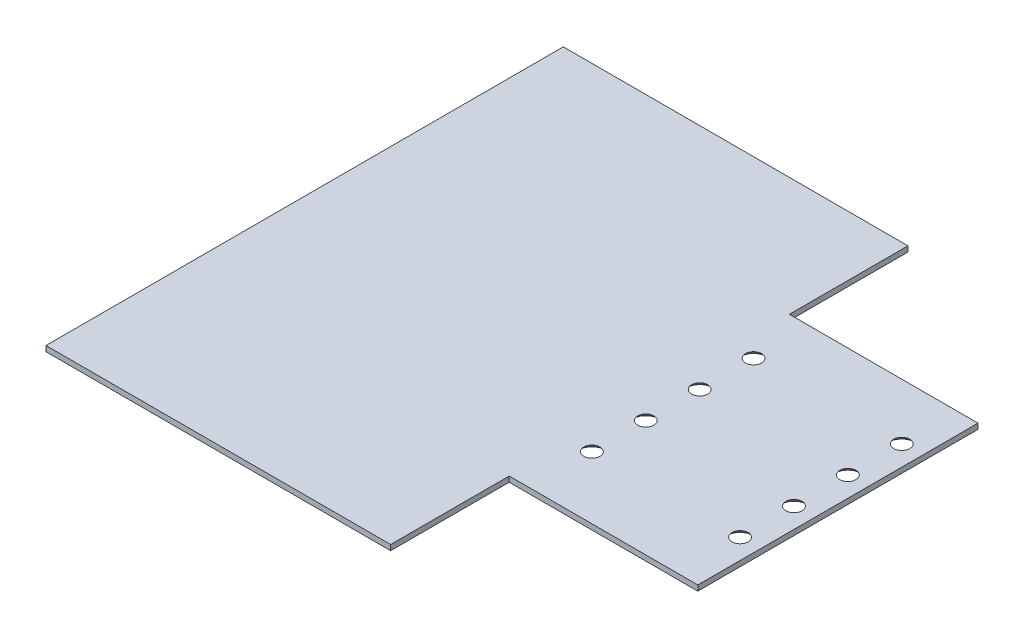
ISO-10303-21;
HEADER;
FILE_DESCRIPTION(('STEP AP214'),'2;1');
FILE_NAME('part.step','',(''),(''),'','','');
FILE_SCHEMA(('AUTOMOTIVE_DESIGN { 1 0 10303 214 1 1 1 1 }'));
ENDSEC;
DATA;
#1=APPLICATION_CONTEXT('core data for automotive mechanical design processes');
#2=APPLICATION_PROTOCOL_DEFINITION('international standard','automotive_design',2000,#1);
#3=PRODUCT_CONTEXT('',#1,'mechanical');
#4=PRODUCT('Part','Part','',(#3));
#5=PRODUCT_RELATED_PRODUCT_CATEGORY('part','',(#4));
#6=PRODUCT_DEFINITION_FORMATION('','',#4);
#7=PRODUCT_DEFINITION_CONTEXT('part definition',#1,'design');
#8=PRODUCT_DEFINITION('design','',#6,#7);
#9=PRODUCT_DEFINITION_SHAPE('','',#8);
#10=(LENGTH_UNIT() NAMED_UNIT(*) SI_UNIT(.MILLI.,.METRE.));
#11=(NAMED_UNIT(*) PLANE_ANGLE_UNIT() SI_UNIT($,.RADIAN.));
#12=(NAMED_UNIT(*) SI_UNIT($,.STERADIAN.) SOLID_ANGLE_UNIT());
#13=UNCERTAINTY_MEASURE_WITH_UNIT(LENGTH_MEASURE(1.E-05),#10,'distance_accuracy_value','');
#14=(GEOMETRIC_REPRESENTATION_CONTEXT(3) GLOBAL_UNCERTAINTY_ASSIGNED_CONTEXT((#13)) GLOBAL_UNIT_ASSIGNED_CONTEXT((#10,
#11,#12)) REPRESENTATION_CONTEXT('',''));
#15=CARTESIAN_POINT('',(0.,0.,0.));
#16=DIRECTION('',(0.,0.,1.));
#17=DIRECTION('',(1.,0.,0.));
#18=AXIS2_PLACEMENT_3D('',#15,#16,#17);
#19=CARTESIAN_POINT('',(-48.9590812442226,1.,47.9999999999896));
#20=DIRECTION('',(0.,0.,-1.));
#21=DIRECTION('',(-1.,0.,0.));
#22=AXIS2_PLACEMENT_3D('',#19,#20,#21);
#23=PLANE('',#22);
#24=DIRECTION('',(1.,0.,0.));
#25=VECTOR('',#24,1.);
#26=CARTESIAN_POINT('',(-48.9590812442226,0.,47.9999999999896));
#27=LINE('',#26,#25);
#28=CARTESIAN_POINT('',(-48.9590812442226,0.,47.9999999999896));
#29=VERTEX_POINT('',#28);
#30=CARTESIAN_POINT('',(15.,0.,47.9999999999896));
#31=VERTEX_POINT('',#30);
#32=EDGE_CURVE('E135',#29,#31,#27,.T.);
#33=ORIENTED_EDGE('',*,*,#32,.T.);
#34=DIRECTION('',(0.,-1.,0.));
#35=VECTOR('',#34,1.);
#36=CARTESIAN_POINT('',(15.,1.,47.9999999999896));
#37=LINE('',#36,#35);
#38=CARTESIAN_POINT('',(15.,1.,47.9999999999896));
#39=VERTEX_POINT('',#38);
#40=EDGE_CURVE('E163',#39,#31,#37,.T.);
#41=ORIENTED_EDGE('',*,*,#40,.F.);
#42=DIRECTION('',(1.,0.,0.));
#43=VECTOR('',#42,1.);
#44=CARTESIAN_POINT('',(-48.9590812442226,1.,47.9999999999896));
#45=LINE('',#44,#43);
#46=CARTESIAN_POINT('',(-48.9590812442226,1.,47.9999999999896));
#47=VERTEX_POINT('',#46);
#48=EDGE_CURVE('E150',#47,#39,#45,.T.);
#49=ORIENTED_EDGE('',*,*,#48,.F.);
#50=DIRECTION('',(0.,-1.,0.));
#51=VECTOR('',#50,1.);
#52=CARTESIAN_POINT('',(-48.9590812442226,1.,47.9999999999896));
#53=LINE('',#52,#51);
#54=EDGE_CURVE('E131',#47,#29,#53,.T.);
#55=ORIENTED_EDGE('',*,*,#54,.T.);
#56=EDGE_LOOP('',(#33,#41,#49,#55));
#57=FACE_BOUND('',#56,.T.);
#58=ADVANCED_FACE('F37',(#57),#23,.F.);
#59=CARTESIAN_POINT('',(15.,1.,26.));
#60=DIRECTION('',(-1.,0.,0.));
#61=DIRECTION('',(0.,0.,1.));
#62=AXIS2_PLACEMENT_3D('',#59,#60,#61);
#63=PLANE('',#62);
#64=DIRECTION('',(0.,0.,-1.));
#65=VECTOR('',#64,1.);
#66=CARTESIAN_POINT('',(15.,0.,26.));
#67=LINE('',#66,#65);
#68=CARTESIAN_POINT('',(15.,0.,26.));
#69=VERTEX_POINT('',#68);
#70=EDGE_CURVE('E138',#31,#69,#67,.T.);
#71=ORIENTED_EDGE('',*,*,#70,.T.);
#72=DIRECTION('',(0.,-1.,0.));
#73=VECTOR('',#72,1.);
#74=CARTESIAN_POINT('',(15.,1.,26.));
#75=LINE('',#74,#73);
#76=CARTESIAN_POINT('',(15.,1.,26.));
#77=VERTEX_POINT('',#76);
#78=EDGE_CURVE('E160',#77,#69,#75,.T.);
#79=ORIENTED_EDGE('',*,*,#78,.F.);
#80=DIRECTION('',(0.,0.,-1.));
#81=VECTOR('',#80,1.);
#82=CARTESIAN_POINT('',(15.,1.,26.));
#83=LINE('',#82,#81);
#84=EDGE_CURVE('E98',#39,#77,#83,.T.);
#85=ORIENTED_EDGE('',*,*,#84,.F.);
#86=ORIENTED_EDGE('',*,*,#40,.T.);
#87=EDGE_LOOP('',(#71,#79,#85,#86));
#88=FACE_BOUND('',#87,.T.);
#89=ADVANCED_FACE('F252',(#88),#63,.F.);
#90=CARTESIAN_POINT('',(50.,1.,26.));
#91=DIRECTION('',(0.,0.,-1.));
#92=DIRECTION('',(-1.,0.,0.));
#93=AXIS2_PLACEMENT_3D('',#90,#91,#92);
#94=PLANE('',#93);
#95=DIRECTION('',(1.,0.,0.));
#96=VECTOR('',#95,1.);
#97=CARTESIAN_POINT('',(50.,0.,26.));
#98=LINE('',#97,#96);
#99=CARTESIAN_POINT('',(50.,0.,26.));
#100=VERTEX_POINT('',#99);
#101=EDGE_CURVE('E141',#69,#100,#98,.T.);
#102=ORIENTED_EDGE('',*,*,#101,.T.);
#103=DIRECTION('',(0.,-1.,0.));
#104=VECTOR('',#103,1.);
#105=CARTESIAN_POINT('',(50.,1.,26.));
#106=LINE('',#105,#104);
#107=CARTESIAN_POINT('',(50.,1.,26.));
#108=VERTEX_POINT('',#107);
#109=EDGE_CURVE('E157',#108,#100,#106,.T.);
#110=ORIENTED_EDGE('',*,*,#109,.F.);
#111=DIRECTION('',(1.,0.,0.));
#112=VECTOR('',#111,1.);
#113=CARTESIAN_POINT('',(50.,1.,26.));
#114=LINE('',#113,#112);
#115=EDGE_CURVE('E221',#77,#108,#114,.T.);
#116=ORIENTED_EDGE('',*,*,#115,.F.);
#117=ORIENTED_EDGE('',*,*,#78,.T.);
#118=EDGE_LOOP('',(#102,#110,#116,#117));
#119=FACE_BOUND('',#118,.T.);
#120=ADVANCED_FACE('F257',(#119),#94,.F.);
#121=CARTESIAN_POINT('',(50.,1.,-26.0000000000104));
#122=DIRECTION('',(-1.,0.,0.));
#123=DIRECTION('',(0.,0.,1.));
#124=AXIS2_PLACEMENT_3D('',#121,#122,#123);
#125=PLANE('',#124);
#126=DIRECTION('',(0.,0.,-1.));
#127=VECTOR('',#126,1.);
#128=CARTESIAN_POINT('',(50.,0.,-26.0000000000104));
#129=LINE('',#128,#127);
#130=CARTESIAN_POINT('',(50.,0.,-26.0000000000104));
#131=VERTEX_POINT('',#130);
#132=EDGE_CURVE('E143',#100,#131,#129,.T.);
#133=ORIENTED_EDGE('',*,*,#132,.T.);
#134=DIRECTION('',(0.,-1.,0.));
#135=VECTOR('',#134,1.);
#136=CARTESIAN_POINT('',(50.,1.,-26.0000000000104));
#137=LINE('',#136,#135);
#138=CARTESIAN_POINT('',(50.,1.,-26.0000000000104));
#139=VERTEX_POINT('',#138);
#140=EDGE_CURVE('E154',#139,#131,#137,.T.);
#141=ORIENTED_EDGE('',*,*,#140,.F.);
#142=DIRECTION('',(0.,0.,-1.));
#143=VECTOR('',#142,1.);
#144=CARTESIAN_POINT('',(50.,1.,-26.0000000000104));
#145=LINE('',#144,#143);
#146=EDGE_CURVE('E223',#108,#139,#145,.T.);
#147=ORIENTED_EDGE('',*,*,#146,.F.);
#148=ORIENTED_EDGE('',*,*,#109,.T.);
#149=EDGE_LOOP('',(#133,#141,#147,#148));
#150=FACE_BOUND('',#149,.T.);
#151=ADVANCED_FACE('F229',(#150),#125,.F.);
#152=CARTESIAN_POINT('',(50.,1.,-26.0000000000104));
#153=DIRECTION('',(0.,0.,1.));
#154=DIRECTION('',(1.,0.,0.));
#155=AXIS2_PLACEMENT_3D('',#152,#153,#154);
#156=PLANE('',#155);
#157=DIRECTION('',(-1.,0.,0.));
#158=VECTOR('',#157,1.);
#159=CARTESIAN_POINT('',(50.,0.,-26.0000000000104));
#160=LINE('',#159,#158);
#161=CARTESIAN_POINT('',(15.,0.,-26.0000000000104));
#162=VERTEX_POINT('',#161);
#163=EDGE_CURVE('E145',#131,#162,#160,.T.);
#164=ORIENTED_EDGE('',*,*,#163,.T.);
#165=DIRECTION('',(0.,-1.,0.));
#166=VECTOR('',#165,1.);
#167=CARTESIAN_POINT('',(15.,1.,-26.0000000000104));
#168=LINE('',#167,#166);
#169=CARTESIAN_POINT('',(15.,1.,-26.0000000000104));
#170=VERTEX_POINT('',#169);
#171=EDGE_CURVE('E126',#170,#162,#168,.T.);
#172=ORIENTED_EDGE('',*,*,#171,.F.);
#173=DIRECTION('',(-1.,0.,0.));
#174=VECTOR('',#173,1.);
#175=CARTESIAN_POINT('',(50.,1.,-26.0000000000104));
#176=LINE('',#175,#174);
#177=EDGE_CURVE('E117',#139,#170,#176,.T.);
#178=ORIENTED_EDGE('',*,*,#177,.F.);
#179=ORIENTED_EDGE('',*,*,#140,.T.);
#180=EDGE_LOOP('',(#164,#172,#178,#179));
#181=FACE_BOUND('',#180,.T.);
#182=ADVANCED_FACE('F233',(#181),#156,.F.);
#183=CARTESIAN_POINT('',(15.,1.,-48.));
#184=DIRECTION('',(-1.,0.,0.));
#185=DIRECTION('',(0.,0.,1.));
#186=AXIS2_PLACEMENT_3D('',#183,#184,#185);
#187=PLANE('',#186);
#188=DIRECTION('',(0.,0.,-1.));
#189=VECTOR('',#188,1.);
#190=CARTESIAN_POINT('',(15.,0.,-48.));
#191=LINE('',#190,#189);
#192=CARTESIAN_POINT('',(15.,0.,-48.));
#193=VERTEX_POINT('',#192);
#194=EDGE_CURVE('E125',#162,#193,#191,.T.);
#195=ORIENTED_EDGE('',*,*,#194,.T.);
#196=DIRECTION('',(0.,-1.,0.));
#197=VECTOR('',#196,1.);
#198=CARTESIAN_POINT('',(15.,1.,-48.));
#199=LINE('',#198,#197);
#200=CARTESIAN_POINT('',(15.,1.,-48.));
#201=VERTEX_POINT('',#200);
#202=EDGE_CURVE('E122',#201,#193,#199,.T.);
#203=ORIENTED_EDGE('',*,*,#202,.F.);
#204=DIRECTION('',(0.,0.,-1.));
#205=VECTOR('',#204,1.);
#206=CARTESIAN_POINT('',(15.,1.,-48.));
#207=LINE('',#206,#205);
#208=EDGE_CURVE('E111',#170,#201,#207,.T.);
#209=ORIENTED_EDGE('',*,*,#208,.F.);
#210=ORIENTED_EDGE('',*,*,#171,.T.);
#211=EDGE_LOOP('',(#195,#203,#209,#210));
#212=FACE_BOUND('',#211,.T.);
#213=ADVANCED_FACE('F123',(#212),#187,.F.);
#214=CARTESIAN_POINT('',(-48.9590812442226,1.,-48.));
#215=DIRECTION('',(0.,0.,1.));
#216=DIRECTION('',(1.,0.,0.));
#217=AXIS2_PLACEMENT_3D('',#214,#215,#216);
#218=PLANE('',#217);
#219=DIRECTION('',(-1.,0.,0.));
#220=VECTOR('',#219,1.);
#221=CARTESIAN_POINT('',(-48.9590812442226,0.,-48.));
#222=LINE('',#221,#220);
#223=CARTESIAN_POINT('',(-48.9590812442226,0.,-48.));
#224=VERTEX_POINT('',#223);
#225=EDGE_CURVE('E83',#193,#224,#222,.T.);
#226=ORIENTED_EDGE('',*,*,#225,.T.);
#227=DIRECTION('',(0.,-1.,0.));
#228=VECTOR('',#227,1.);
#229=CARTESIAN_POINT('',(-48.9590812442226,1.,-48.));
#230=LINE('',#229,#228);
#231=CARTESIAN_POINT('',(-48.9590812442226,1.,-48.));
#232=VERTEX_POINT('',#231);
#233=EDGE_CURVE('E127',#232,#224,#230,.T.);
#234=ORIENTED_EDGE('',*,*,#233,.F.);
#235=DIRECTION('',(-1.,0.,0.));
#236=VECTOR('',#235,1.);
#237=CARTESIAN_POINT('',(-48.9590812442226,1.,-48.));
#238=LINE('',#237,#236);
#239=EDGE_CURVE('E115',#201,#232,#238,.T.);
#240=ORIENTED_EDGE('',*,*,#239,.F.);
#241=ORIENTED_EDGE('',*,*,#202,.T.);
#242=EDGE_LOOP('',(#226,#234,#240,#241));
#243=FACE_BOUND('',#242,.T.);
#244=ADVANCED_FACE('F129',(#243),#218,.F.);
#245=CARTESIAN_POINT('',(-48.9590812442226,1.,-48.));
#246=DIRECTION('',(1.,0.,0.));
#247=DIRECTION('',(0.,0.,-1.));
#248=AXIS2_PLACEMENT_3D('',#245,#246,#247);
#249=PLANE('',#248);
#250=DIRECTION('',(0.,0.,1.));
#251=VECTOR('',#250,1.);
#252=CARTESIAN_POINT('',(-48.9590812442226,0.,-48.));
#253=LINE('',#252,#251);
#254=EDGE_CURVE('E89',#224,#29,#253,.T.);
#255=ORIENTED_EDGE('',*,*,#254,.T.);
#256=ORIENTED_EDGE('',*,*,#54,.F.);
#257=DIRECTION('',(0.,0.,1.));
#258=VECTOR('',#257,1.);
#259=CARTESIAN_POINT('',(-48.9590812442226,1.,-48.));
#260=LINE('',#259,#258);
#261=EDGE_CURVE('E54',#232,#47,#260,.T.);
#262=ORIENTED_EDGE('',*,*,#261,.F.);
#263=ORIENTED_EDGE('',*,*,#233,.T.);
#264=EDGE_LOOP('',(#255,#256,#262,#263));
#265=FACE_BOUND('',#264,.T.);
#266=ADVANCED_FACE('F240',(#265),#249,.F.);
#267=CARTESIAN_POINT('',(0.,1.,0.));
#268=DIRECTION('',(0.,-1.,0.));
#269=DIRECTION('',(0.,0.,-1.));
#270=AXIS2_PLACEMENT_3D('',#267,#268,#269);
#271=PLANE('',#270);
#272=CARTESIAN_POINT('',(46.2500000000001,1.,-5.60000000007162));
#273=DIRECTION('',(0.,1.,0.));
#274=DIRECTION('',(0.,0.,1.));
#275=AXIS2_PLACEMENT_3D('',#272,#273,#274);
#276=CIRCLE('',#275,1.49999999999968);
#277=CARTESIAN_POINT('',(46.2500000000001,1.,-4.10000000007195));
#278=VERTEX_POINT('',#277);
#279=EDGE_CURVE('E198',#278,#278,#276,.T.);
#280=ORIENTED_EDGE('',*,*,#279,.F.);
#281=EDGE_LOOP('',(#280));
#282=FACE_BOUND('',#281,.T.);
#283=CARTESIAN_POINT('',(18.7500000000001,1.,4.39999999992838));
#284=DIRECTION('',(0.,1.,0.));
#285=DIRECTION('',(0.,0.,1.));
#286=AXIS2_PLACEMENT_3D('',#283,#284,#285);
#287=CIRCLE('',#286,1.4999999999992);
#288=CARTESIAN_POINT('',(18.7500000000001,1.,5.89999999992757));
#289=VERTEX_POINT('',#288);
#290=EDGE_CURVE('E202',#289,#289,#287,.T.);
#291=ORIENTED_EDGE('',*,*,#290,.F.);
#292=EDGE_LOOP('',(#291));
#293=FACE_BOUND('',#292,.T.);
#294=CARTESIAN_POINT('',(46.2500000000001,1.,4.39999999992838));
#295=DIRECTION('',(0.,1.,0.));
#296=DIRECTION('',(0.,0.,1.));
#297=AXIS2_PLACEMENT_3D('',#294,#295,#296);
#298=CIRCLE('',#297,1.49999999999968);
#299=CARTESIAN_POINT('',(46.2500000000001,1.,5.89999999992805));
#300=VERTEX_POINT('',#299);
#301=EDGE_CURVE('E210',#300,#300,#298,.T.);
#302=ORIENTED_EDGE('',*,*,#301,.F.);
#303=EDGE_LOOP('',(#302));
#304=FACE_BOUND('',#303,.T.);
#305=CARTESIAN_POINT('',(18.7500000000002,1.,14.3999999999284));
#306=DIRECTION('',(0.,1.,0.));
#307=DIRECTION('',(0.,0.,1.));
#308=AXIS2_PLACEMENT_3D('',#305,#306,#307);
#309=CIRCLE('',#308,1.4999999999992);
#310=CARTESIAN_POINT('',(18.7500000000002,1.,15.8999999999276));
#311=VERTEX_POINT('',#310);
#312=EDGE_CURVE('E212',#311,#311,#309,.T.);
#313=ORIENTED_EDGE('',*,*,#312,.F.);
#314=EDGE_LOOP('',(#313));
#315=FACE_BOUND('',#314,.T.);
#316=CARTESIAN_POINT('',(18.75,1.,-15.6000000000716));
#317=DIRECTION('',(0.,1.,0.));
#318=DIRECTION('',(0.,0.,1.));
#319=AXIS2_PLACEMENT_3D('',#316,#317,#318);
#320=CIRCLE('',#319,1.49999999999919);
#321=CARTESIAN_POINT('',(18.75,1.,-14.1000000000724));
#322=VERTEX_POINT('',#321);
#323=EDGE_CURVE('E205',#322,#322,#320,.T.);
#324=ORIENTED_EDGE('',*,*,#323,.F.);
#325=EDGE_LOOP('',(#324));
#326=FACE_BOUND('',#325,.T.);
#327=CARTESIAN_POINT('',(46.25,1.,-15.6000000000716));
#328=DIRECTION('',(0.,1.,0.));
#329=DIRECTION('',(0.,0.,1.));
#330=AXIS2_PLACEMENT_3D('',#327,#328,#329);
#331=CIRCLE('',#330,1.49999999999968);
#332=CARTESIAN_POINT('',(46.25,1.,-14.1000000000719));
#333=VERTEX_POINT('',#332);
#334=EDGE_CURVE('E199',#333,#333,#331,.T.);
#335=ORIENTED_EDGE('',*,*,#334,.F.);
#336=EDGE_LOOP('',(#335));
#337=FACE_BOUND('',#336,.T.);
#338=CARTESIAN_POINT('',(18.7500000000001,1.,-5.60000000007162));
#339=DIRECTION('',(0.,1.,0.));
#340=DIRECTION('',(0.,0.,1.));
#341=AXIS2_PLACEMENT_3D('',#338,#339,#340);
#342=CIRCLE('',#341,1.4999999999992);
#343=CARTESIAN_POINT('',(18.7500000000001,1.,-4.10000000007243));
#344=VERTEX_POINT('',#343);
#345=EDGE_CURVE('E196',#344,#344,#342,.T.);
#346=ORIENTED_EDGE('',*,*,#345,.F.);
#347=EDGE_LOOP('',(#346));
#348=FACE_BOUND('',#347,.T.);
#349=CARTESIAN_POINT('',(46.2500000000001,1.,14.3999999999284));
#350=DIRECTION('',(0.,1.,0.));
#351=DIRECTION('',(0.,0.,1.));
#352=AXIS2_PLACEMENT_3D('',#349,#350,#351);
#353=CIRCLE('',#352,1.49999999999968);
#354=CARTESIAN_POINT('',(46.2500000000001,1.,15.8999999999281));
#355=VERTEX_POINT('',#354);
#356=EDGE_CURVE('E139',#355,#355,#353,.T.);
#357=ORIENTED_EDGE('',*,*,#356,.F.);
#358=EDGE_LOOP('',(#357));
#359=FACE_BOUND('',#358,.T.);
#360=ORIENTED_EDGE('',*,*,#48,.T.);
#361=ORIENTED_EDGE('',*,*,#84,.T.);
#362=ORIENTED_EDGE('',*,*,#115,.T.);
#363=ORIENTED_EDGE('',*,*,#146,.T.);
#364=ORIENTED_EDGE('',*,*,#177,.T.);
#365=ORIENTED_EDGE('',*,*,#208,.T.);
#366=ORIENTED_EDGE('',*,*,#239,.T.);
#367=ORIENTED_EDGE('',*,*,#261,.T.);
#368=EDGE_LOOP('',(#360,#361,#362,#363,#364,#365,#366,#367));
#369=FACE_BOUND('',#368,.T.);
#370=ADVANCED_FACE('F113',(#282,#293,#304,#315,#326,#337,#348,#359,#369),#271,.F.);
#371=CARTESIAN_POINT('',(0.,0.,0.));
#372=DIRECTION('',(0.,-1.,0.));
#373=DIRECTION('',(0.,0.,-1.));
#374=AXIS2_PLACEMENT_3D('',#371,#372,#373);
#375=PLANE('',#374);
#376=CARTESIAN_POINT('',(18.75,0.,-15.6000000000716));
#377=DIRECTION('',(0.,-1.,0.));
#378=DIRECTION('',(0.,0.,-1.));
#379=AXIS2_PLACEMENT_3D('',#376,#377,#378);
#380=CIRCLE('',#379,2.49999999999921);
#381=CARTESIAN_POINT('',(18.75,0.,-18.1000000000708));
#382=VERTEX_POINT('',#381);
#383=EDGE_CURVE('E11',#382,#382,#380,.F.);
#384=ORIENTED_EDGE('',*,*,#383,.T.);
#385=EDGE_LOOP('',(#384));
#386=FACE_BOUND('',#385,.T.);
#387=CARTESIAN_POINT('',(18.7500000000001,0.,-5.60000000007162));
#388=DIRECTION('',(0.,-1.,0.));
#389=DIRECTION('',(0.,0.,-1.));
#390=AXIS2_PLACEMENT_3D('',#387,#388,#389);
#391=CIRCLE('',#390,2.49999999999921);
#392=CARTESIAN_POINT('',(18.7500000000001,0.,-8.10000000007084));
#393=VERTEX_POINT('',#392);
#394=EDGE_CURVE('E46',#393,#393,#391,.F.);
#395=ORIENTED_EDGE('',*,*,#394,.T.);
#396=EDGE_LOOP('',(#395));
#397=FACE_BOUND('',#396,.T.);
#398=CARTESIAN_POINT('',(18.7500000000001,0.,4.39999999992838));
#399=DIRECTION('',(0.,-1.,0.));
#400=DIRECTION('',(0.,0.,-1.));
#401=AXIS2_PLACEMENT_3D('',#398,#399,#400);
#402=CIRCLE('',#401,2.49999999999921);
#403=CARTESIAN_POINT('',(18.7500000000001,0.,1.89999999992916));
#404=VERTEX_POINT('',#403);
#405=EDGE_CURVE('E180',#404,#404,#402,.F.);
#406=ORIENTED_EDGE('',*,*,#405,.T.);
#407=EDGE_LOOP('',(#406));
#408=FACE_BOUND('',#407,.T.);
#409=CARTESIAN_POINT('',(18.7500000000002,0.,14.3999999999284));
#410=DIRECTION('',(0.,-1.,0.));
#411=DIRECTION('',(0.,0.,-1.));
#412=AXIS2_PLACEMENT_3D('',#409,#410,#411);
#413=CIRCLE('',#412,2.49999999999921);
#414=CARTESIAN_POINT('',(18.7500000000002,0.,11.8999999999292));
#415=VERTEX_POINT('',#414);
#416=EDGE_CURVE('E177',#415,#415,#413,.F.);
#417=ORIENTED_EDGE('',*,*,#416,.T.);
#418=EDGE_LOOP('',(#417));
#419=FACE_BOUND('',#418,.T.);
#420=CARTESIAN_POINT('',(46.25,0.,-15.6000000000716));
#421=DIRECTION('',(0.,-1.,0.));
#422=DIRECTION('',(0.,0.,-1.));
#423=AXIS2_PLACEMENT_3D('',#420,#421,#422);
#424=CIRCLE('',#423,2.4999999999997);
#425=CARTESIAN_POINT('',(46.25,0.,-18.1000000000713));
#426=VERTEX_POINT('',#425);
#427=EDGE_CURVE('E174',#426,#426,#424,.F.);
#428=ORIENTED_EDGE('',*,*,#427,.T.);
#429=EDGE_LOOP('',(#428));
#430=FACE_BOUND('',#429,.T.);
#431=CARTESIAN_POINT('',(46.2500000000001,0.,-5.60000000007162));
#432=DIRECTION('',(0.,-1.,0.));
#433=DIRECTION('',(0.,0.,-1.));
#434=AXIS2_PLACEMENT_3D('',#431,#432,#433);
#435=CIRCLE('',#434,2.4999999999997);
#436=CARTESIAN_POINT('',(46.2500000000001,0.,-8.10000000007132));
#437=VERTEX_POINT('',#436);
#438=EDGE_CURVE('E171',#437,#437,#435,.F.);
#439=ORIENTED_EDGE('',*,*,#438,.T.);
#440=EDGE_LOOP('',(#439));
#441=FACE_BOUND('',#440,.T.);
#442=CARTESIAN_POINT('',(46.2500000000001,0.,4.39999999992838));
#443=DIRECTION('',(0.,-1.,0.));
#444=DIRECTION('',(0.,0.,-1.));
#445=AXIS2_PLACEMENT_3D('',#442,#443,#444);
#446=CIRCLE('',#445,2.4999999999997);
#447=CARTESIAN_POINT('',(46.2500000000001,0.,1.89999999992868));
#448=VERTEX_POINT('',#447);
#449=EDGE_CURVE('E168',#448,#448,#446,.F.);
#450=ORIENTED_EDGE('',*,*,#449,.T.);
#451=EDGE_LOOP('',(#450));
#452=FACE_BOUND('',#451,.T.);
#453=CARTESIAN_POINT('',(46.2500000000001,0.,14.3999999999284));
#454=DIRECTION('',(0.,-1.,0.));
#455=DIRECTION('',(0.,0.,-1.));
#456=AXIS2_PLACEMENT_3D('',#453,#454,#455);
#457=CIRCLE('',#456,2.49999999999969);
#458=CARTESIAN_POINT('',(46.2500000000001,0.,11.8999999999287));
#459=VERTEX_POINT('',#458);
#460=EDGE_CURVE('E165',#459,#459,#457,.F.);
#461=ORIENTED_EDGE('',*,*,#460,.T.);
#462=EDGE_LOOP('',(#461));
#463=FACE_BOUND('',#462,.T.);
#464=ORIENTED_EDGE('',*,*,#32,.F.);
#465=ORIENTED_EDGE('',*,*,#254,.F.);
#466=ORIENTED_EDGE('',*,*,#225,.F.);
#467=ORIENTED_EDGE('',*,*,#194,.F.);
#468=ORIENTED_EDGE('',*,*,#163,.F.);
#469=ORIENTED_EDGE('',*,*,#132,.F.);
#470=ORIENTED_EDGE('',*,*,#101,.F.);
#471=ORIENTED_EDGE('',*,*,#70,.F.);
#472=EDGE_LOOP('',(#464,#465,#466,#467,#468,#469,#470,#471));
#473=FACE_BOUND('',#472,.T.);
#474=ADVANCED_FACE('F185',(#386,#397,#408,#419,#430,#441,#452,#463,#473),#375,.T.);
#475=CARTESIAN_POINT('',(18.75,1.00000000000001,-15.6000000000716));
#476=DIRECTION('',(0.,-1.,0.));
#477=DIRECTION('',(0.,0.,-1.));
#478=AXIS2_PLACEMENT_3D('',#475,#476,#477);
#479=CONICAL_SURFACE('',#478,1.49999999999919,0.785398163397453);
#480=ORIENTED_EDGE('',*,*,#383,.F.);
#481=EDGE_LOOP('',(#480));
#482=FACE_BOUND('',#481,.T.);
#483=ORIENTED_EDGE('',*,*,#323,.T.);
#484=EDGE_LOOP('',(#483));
#485=FACE_BOUND('',#484,.T.);
#486=ADVANCED_FACE('F192',(#482,#485),#479,.F.);
#487=CARTESIAN_POINT('',(18.7500000000001,1.00000000000001,-5.60000000007162));
#488=DIRECTION('',(0.,-1.,0.));
#489=DIRECTION('',(0.,0.,-1.));
#490=AXIS2_PLACEMENT_3D('',#487,#488,#489);
#491=CONICAL_SURFACE('',#490,1.4999999999992,0.785398163397453);
#492=ORIENTED_EDGE('',*,*,#394,.F.);
#493=EDGE_LOOP('',(#492));
#494=FACE_BOUND('',#493,.T.);
#495=ORIENTED_EDGE('',*,*,#345,.T.);
#496=EDGE_LOOP('',(#495));
#497=FACE_BOUND('',#496,.T.);
#498=ADVANCED_FACE('F188',(#494,#497),#491,.F.);
#499=CARTESIAN_POINT('',(18.7500000000001,1.00000000000001,4.39999999992838));
#500=DIRECTION('',(0.,-1.,0.));
#501=DIRECTION('',(0.,0.,-1.));
#502=AXIS2_PLACEMENT_3D('',#499,#500,#501);
#503=CONICAL_SURFACE('',#502,1.4999999999992,0.785398163397453);
#504=ORIENTED_EDGE('',*,*,#405,.F.);
#505=EDGE_LOOP('',(#504));
#506=FACE_BOUND('',#505,.T.);
#507=ORIENTED_EDGE('',*,*,#290,.T.);
#508=EDGE_LOOP('',(#507));
#509=FACE_BOUND('',#508,.T.);
#510=ADVANCED_FACE('F191',(#506,#509),#503,.F.);
#511=CARTESIAN_POINT('',(18.7500000000002,1.00000000000001,14.3999999999284));
#512=DIRECTION('',(0.,-1.,0.));
#513=DIRECTION('',(0.,0.,-1.));
#514=AXIS2_PLACEMENT_3D('',#511,#512,#513);
#515=CONICAL_SURFACE('',#514,1.4999999999992,0.785398163397454);
#516=ORIENTED_EDGE('',*,*,#416,.F.);
#517=EDGE_LOOP('',(#516));
#518=FACE_BOUND('',#517,.T.);
#519=ORIENTED_EDGE('',*,*,#312,.T.);
#520=EDGE_LOOP('',(#519));
#521=FACE_BOUND('',#520,.T.);
#522=ADVANCED_FACE('F266',(#518,#521),#515,.F.);
#523=CARTESIAN_POINT('',(46.25,1.00000000000001,-15.6000000000716));
#524=DIRECTION('',(0.,-1.,0.));
#525=DIRECTION('',(0.,0.,-1.));
#526=AXIS2_PLACEMENT_3D('',#523,#524,#525);
#527=CONICAL_SURFACE('',#526,1.49999999999968,0.785398163397453);
#528=ORIENTED_EDGE('',*,*,#427,.F.);
#529=EDGE_LOOP('',(#528));
#530=FACE_BOUND('',#529,.T.);
#531=ORIENTED_EDGE('',*,*,#334,.T.);
#532=EDGE_LOOP('',(#531));
#533=FACE_BOUND('',#532,.T.);
#534=ADVANCED_FACE('F270',(#530,#533),#527,.F.);
#535=CARTESIAN_POINT('',(46.2500000000001,1.00000000000001,-5.60000000007162));
#536=DIRECTION('',(0.,-1.,0.));
#537=DIRECTION('',(0.,0.,-1.));
#538=AXIS2_PLACEMENT_3D('',#535,#536,#537);
#539=CONICAL_SURFACE('',#538,1.49999999999968,0.785398163397453);
#540=ORIENTED_EDGE('',*,*,#438,.F.);
#541=EDGE_LOOP('',(#540));
#542=FACE_BOUND('',#541,.T.);
#543=ORIENTED_EDGE('',*,*,#279,.T.);
#544=EDGE_LOOP('',(#543));
#545=FACE_BOUND('',#544,.T.);
#546=ADVANCED_FACE('F274',(#542,#545),#539,.F.);
#547=CARTESIAN_POINT('',(46.2500000000001,1.00000000000001,4.39999999992838));
#548=DIRECTION('',(0.,-1.,0.));
#549=DIRECTION('',(0.,0.,-1.));
#550=AXIS2_PLACEMENT_3D('',#547,#548,#549);
#551=CONICAL_SURFACE('',#550,1.49999999999968,0.785398163397453);
#552=ORIENTED_EDGE('',*,*,#449,.F.);
#553=EDGE_LOOP('',(#552));
#554=FACE_BOUND('',#553,.T.);
#555=ORIENTED_EDGE('',*,*,#301,.T.);
#556=EDGE_LOOP('',(#555));
#557=FACE_BOUND('',#556,.T.);
#558=ADVANCED_FACE('F277',(#554,#557),#551,.F.);
#559=CARTESIAN_POINT('',(46.2500000000001,1.00000000000001,14.3999999999284));
#560=DIRECTION('',(0.,-1.,0.));
#561=DIRECTION('',(0.,0.,-1.));
#562=AXIS2_PLACEMENT_3D('',#559,#560,#561);
#563=CONICAL_SURFACE('',#562,1.49999999999968,0.785398163397452);
#564=ORIENTED_EDGE('',*,*,#460,.F.);
#565=EDGE_LOOP('',(#564));
#566=FACE_BOUND('',#565,.T.);
#567=ORIENTED_EDGE('',*,*,#356,.T.);
#568=EDGE_LOOP('',(#567));
#569=FACE_BOUND('',#568,.T.);
#570=ADVANCED_FACE('F39',(#566,#569),#563,.F.);
#571=CLOSED_SHELL('',(#58,#89,#120,#151,#182,#213,#244,#266,#370,#474,#486,#498,#510,#522,#534,
#546,#558,#570));
#572=MANIFOLD_SOLID_BREP('B2',#571);
#573=ADVANCED_BREP_SHAPE_REPRESENTATION('',(#18,#572),#14);
#574=SHAPE_DEFINITION_REPRESENTATION(#9,#573);
ENDSEC;
END-ISO-10303-21;
